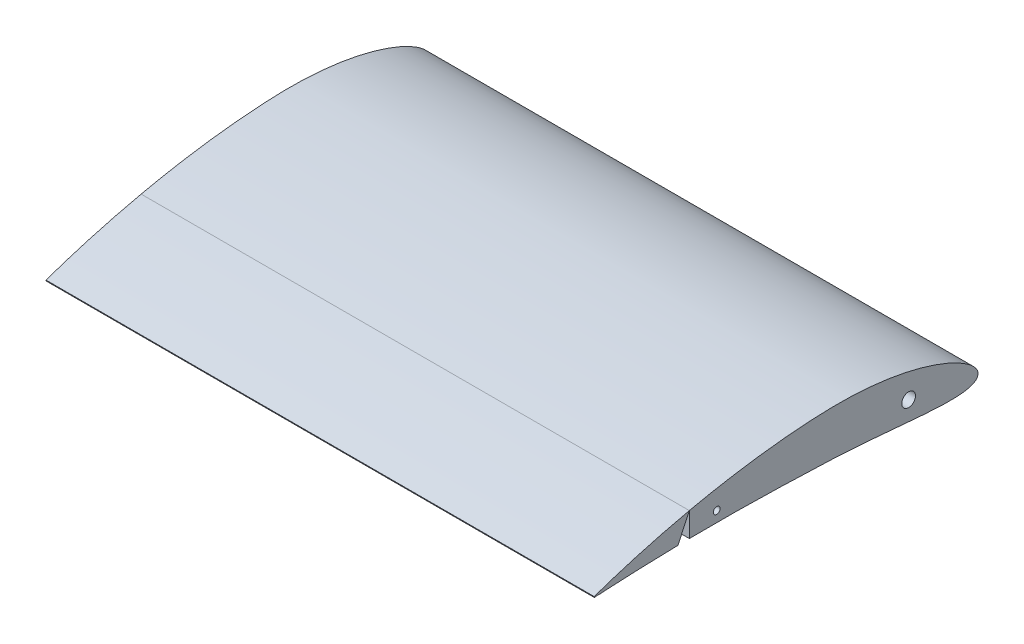
ISO-10303-21;
HEADER;
FILE_DESCRIPTION(('STEP AP214'),'2;1');
FILE_NAME('part.step','',(''),(''),'','','');
FILE_SCHEMA(('AUTOMOTIVE_DESIGN { 1 0 10303 214 1 1 1 1 }'));
ENDSEC;
DATA;
#1=APPLICATION_CONTEXT('core data for automotive mechanical design processes');
#2=APPLICATION_PROTOCOL_DEFINITION('international standard','automotive_design',2000,#1);
#3=PRODUCT_CONTEXT('',#1,'mechanical');
#4=PRODUCT('Part','Part','',(#3));
#5=PRODUCT_RELATED_PRODUCT_CATEGORY('part','',(#4));
#6=PRODUCT_DEFINITION_FORMATION('','',#4);
#7=PRODUCT_DEFINITION_CONTEXT('part definition',#1,'design');
#8=PRODUCT_DEFINITION('design','',#6,#7);
#9=PRODUCT_DEFINITION_SHAPE('','',#8);
#10=(LENGTH_UNIT() NAMED_UNIT(*) SI_UNIT(.MILLI.,.METRE.));
#11=(NAMED_UNIT(*) PLANE_ANGLE_UNIT() SI_UNIT($,.RADIAN.));
#12=(NAMED_UNIT(*) SI_UNIT($,.STERADIAN.) SOLID_ANGLE_UNIT());
#13=UNCERTAINTY_MEASURE_WITH_UNIT(LENGTH_MEASURE(1.E-05),#10,'distance_accuracy_value','');
#14=(GEOMETRIC_REPRESENTATION_CONTEXT(3) GLOBAL_UNCERTAINTY_ASSIGNED_CONTEXT((#13)) GLOBAL_UNIT_ASSIGNED_CONTEXT((#10,
#11,#12)) REPRESENTATION_CONTEXT('',''));
#15=CARTESIAN_POINT('',(0.,0.,0.));
#16=DIRECTION('',(0.,0.,1.));
#17=DIRECTION('',(1.,0.,0.));
#18=AXIS2_PLACEMENT_3D('',#15,#16,#17);
#19=CARTESIAN_POINT('',(-254.,-0.0302571964763549,354.787327227915));
#20=CARTESIAN_POINT('',(-254.,-0.202511549774369,354.777220058735));
#21=CARTESIAN_POINT('',(-254.,-0.758116619532224,354.744619463571));
#22=CARTESIAN_POINT('',(-254.,-0.0353878265544988,352.780150329408));
#23=CARTESIAN_POINT('',(-254.,-0.406394891328532,350.227621537646));
#24=CARTESIAN_POINT('',(-254.,0.191518705423128,345.076973542852));
#25=CARTESIAN_POINT('',(-254.,0.426846954997304,338.388880463138));
#26=CARTESIAN_POINT('',(-254.,0.912902226587254,329.767358245601));
#27=CARTESIAN_POINT('',(-254.,1.37107480853054,319.513378005819));
#28=CARTESIAN_POINT('',(-254.,1.85212662662604,307.681856469284));
#29=CARTESIAN_POINT('',(-254.,2.2828903737653,294.437996631764));
#30=CARTESIAN_POINT('',(-254.,2.65636592644588,279.933149694368));
#31=CARTESIAN_POINT('',(-254.,2.90744759821903,264.337268620967));
#32=CARTESIAN_POINT('',(-254.,3.02848065946825,247.830237404837));
#33=CARTESIAN_POINT('',(-254.,2.97910623211237,224.541124113717));
#34=CARTESIAN_POINT('',(-254.,2.58624656268472,200.671973719441));
#35=CARTESIAN_POINT('',(-254.,1.91789319340299,176.483884619505));
#36=CARTESIAN_POINT('',(-254.,1.28674404323604,158.296467958687));
#37=CARTESIAN_POINT('',(-254.,0.674535202653767,140.48477689744));
#38=CARTESIAN_POINT('',(-254.,-0.458414507964394,117.937239158073));
#39=CARTESIAN_POINT('',(-254.,-2.15355585803942,96.4067365521407));
#40=CARTESIAN_POINT('',(-254.,-3.98391169785236,75.9298626432168));
#41=CARTESIAN_POINT('',(-254.,-5.23803481691952,61.9523939500743));
#42=CARTESIAN_POINT('',(-254.,-6.3018667845873,49.0830780174977));
#43=CARTESIAN_POINT('',(-254.,-7.05379709208437,37.4470572233417));
#44=CARTESIAN_POINT('',(-254.,-7.40487495085787,27.1638266260831));
#45=CARTESIAN_POINT('',(-254.,-7.26852765592077,18.3491197902741));
#46=CARTESIAN_POINT('',(-254.,-6.58746462442697,11.0873159681167));
#47=CARTESIAN_POINT('',(-254.,-5.28808573883758,5.4507808849597));
#48=CARTESIAN_POINT('',(-254.,-3.30894318563573,1.35108725963543));
#49=CARTESIAN_POINT('',(-254.,-0.148325215865237,-0.987487677240321));
#50=CARTESIAN_POINT('',(-254.,3.7967578133831,-0.765838064798878));
#51=CARTESIAN_POINT('',(-254.,7.71649979382027,1.67922407257184));
#52=CARTESIAN_POINT('',(-254.,11.8553419578337,5.92689766090299));
#53=CARTESIAN_POINT('',(-254.,16.2262899348965,12.1072031542234));
#54=CARTESIAN_POINT('',(-254.,20.7343193498453,20.187014187513));
#55=CARTESIAN_POINT('',(-254.,25.2201252971746,30.130463623116));
#56=CARTESIAN_POINT('',(-254.,29.5108543834638,41.8433907768923));
#57=CARTESIAN_POINT('',(-254.,33.4329059974258,55.1997604360673));
#58=CARTESIAN_POINT('',(-254.,36.8104805743368,70.0434509571498));
#59=CARTESIAN_POINT('',(-254.,39.4786761807971,86.1884085277303));
#60=CARTESIAN_POINT('',(-254.,41.32105063238,103.42216726238));
#61=CARTESIAN_POINT('',(-254.,42.2288581946823,121.516747473044));
#62=CARTESIAN_POINT('',(-254.,42.1113766684293,140.09669102153));
#63=CARTESIAN_POINT('',(-254.,41.1132128906756,158.902335219002));
#64=CARTESIAN_POINT('',(-254.,39.0904540579609,183.961657870227));
#65=CARTESIAN_POINT('',(-254.,36.0047557168601,208.774809212926));
#66=CARTESIAN_POINT('',(-254.,31.1455287976255,238.622276389231));
#67=CARTESIAN_POINT('',(-254.,26.6515697314507,261.175777938493));
#68=CARTESIAN_POINT('',(-254.,21.7242725259394,282.422876263721));
#69=CARTESIAN_POINT('',(-254.,17.1306006385399,300.598349456261));
#70=CARTESIAN_POINT('',(-254.,11.7988919274353,319.654473711953));
#71=CARTESIAN_POINT('',(-254.,6.72155114802005,336.024074691811));
#72=CARTESIAN_POINT('',(-254.,3.49779827393597,345.800950265157));
#73=CARTESIAN_POINT('',(-254.,1.92709586834348,350.478726649503));
#74=CARTESIAN_POINT('',(-254.,0.953557869568799,353.29965963041));
#75=CARTESIAN_POINT('',(-254.,0.519388000117919,354.559877308969));
#76=CARTESIAN_POINT('',(-254.,0.410417886541196,354.876173010782));
#77=B_SPLINE_CURVE_WITH_KNOTS('',3,(#19,#20,#21,#22,#23,#24,#25,#26,#27,#28,#29,#30,#31,#32,#33,
#34,#35,#36,#37,#38,#39,#40,#41,#42,#43,#44,#45,#46,#47,#48,#49,#50,#51,#52,#53,#54,#55,#56,#57,
#58,#59,#60,#61,#62,#63,#64,#65,#66,#67,#68,#69,#70,#71,#72,#73,#74,#75,#76),.UNSPECIFIED.,.F.,
.F.,(4,1,1,1,1,1,1,1,1,1,1,1,1,1,1,1,1,1,1,1,1,1,1,1,1,1,1,1,1,1,1,1,1,1,1,1,1,1,1,1,1,1,1,1,1,
1,1,1,1,1,1,1,1,1,1,4),(0.,0.00061435602735338,0.00198160056276364,0.00606849911990259,
0.0128259983002053,0.0221600600259541,0.0339528411484215,0.0480573219049674,0.0643016527838605,
0.0824806064748046,0.102390013464696,0.123786894847983,0.146429707819126,0.170067604158041,
0.219268231220122,0.244299756437978,0.269272617042279,0.293879334559277,0.317367886846568,
0.361825599196296,0.382415541627446,0.401655123624231,0.419361860817184,0.435356743556399,
0.44945739068769,0.461534248286615,0.471483960270294,0.479298491667603,0.485175806315722,
0.489815015537041,0.49445371882196,0.500384211459872,0.508369297965653,0.518670584727767,
0.531320006060474,0.54625561026072,0.563345994084458,0.58242326585592,0.60328874622392,
0.625720296766354,0.649474912467889,0.674310012117921,0.699958821683972,0.725614899189679,
0.751503233324799,0.803021620411888,0.828087427427487,0.875472920842336,0.897280851310736,
0.917503738861992,0.952328750245583,0.978398030734231,0.987765198149775,0.994535224157492,
0.998628423374974,1.),.UNSPECIFIED.);
#78=DIRECTION('',(1.,0.,0.));
#79=VECTOR('',#78,1.);
#80=SURFACE_OF_LINEAR_EXTRUSION('',#77,#79);
#81=DIRECTION('',(1.,0.,0.));
#82=VECTOR('',#81,1.);
#83=CARTESIAN_POINT('',(-254.,2.68576626150921,277.250314183645));
#84=LINE('',#83,#82);
#85=CARTESIAN_POINT('',(-254.,2.6857662610756,277.250314183847));
#86=VERTEX_POINT('',#85);
#87=CARTESIAN_POINT('',(254.,2.68576626107558,277.250314183847));
#88=VERTEX_POINT('',#87);
#89=EDGE_CURVE('E68',#86,#88,#84,.T.);
#90=ORIENTED_EDGE('',*,*,#89,.T.);
#91=CARTESIAN_POINT('',(254.,-0.0302571964763549,354.787327227915));
#92=CARTESIAN_POINT('',(254.,-0.202511549774369,354.777220058735));
#93=CARTESIAN_POINT('',(254.,-0.758116619532224,354.744619463571));
#94=CARTESIAN_POINT('',(254.,-0.0353878265544988,352.780150329408));
#95=CARTESIAN_POINT('',(254.,-0.406394891328532,350.227621537646));
#96=CARTESIAN_POINT('',(254.,0.191518705423128,345.076973542852));
#97=CARTESIAN_POINT('',(254.,0.426846954997304,338.388880463138));
#98=CARTESIAN_POINT('',(254.,0.912902226587254,329.767358245601));
#99=CARTESIAN_POINT('',(254.,1.37107480853054,319.513378005819));
#100=CARTESIAN_POINT('',(254.,1.85212662662604,307.681856469284));
#101=CARTESIAN_POINT('',(254.,2.2828903737653,294.437996631764));
#102=CARTESIAN_POINT('',(254.,2.65636592644588,279.933149694368));
#103=CARTESIAN_POINT('',(254.,2.90744759821903,264.337268620967));
#104=CARTESIAN_POINT('',(254.,3.02848065946825,247.830237404837));
#105=CARTESIAN_POINT('',(254.,2.97910623211237,224.541124113717));
#106=CARTESIAN_POINT('',(254.,2.58624656268472,200.671973719441));
#107=CARTESIAN_POINT('',(254.,1.91789319340299,176.483884619505));
#108=CARTESIAN_POINT('',(254.,1.28674404323604,158.296467958687));
#109=CARTESIAN_POINT('',(254.,0.674535202653767,140.48477689744));
#110=CARTESIAN_POINT('',(254.,-0.458414507964394,117.937239158073));
#111=CARTESIAN_POINT('',(254.,-2.15355585803942,96.4067365521407));
#112=CARTESIAN_POINT('',(254.,-3.98391169785236,75.9298626432168));
#113=CARTESIAN_POINT('',(254.,-5.23803481691952,61.9523939500743));
#114=CARTESIAN_POINT('',(254.,-6.3018667845873,49.0830780174977));
#115=CARTESIAN_POINT('',(254.,-7.05379709208437,37.4470572233417));
#116=CARTESIAN_POINT('',(254.,-7.40487495085787,27.1638266260831));
#117=CARTESIAN_POINT('',(254.,-7.26852765592077,18.3491197902741));
#118=CARTESIAN_POINT('',(254.,-6.58746462442697,11.0873159681167));
#119=CARTESIAN_POINT('',(254.,-5.28808573883758,5.4507808849597));
#120=CARTESIAN_POINT('',(254.,-3.30894318563573,1.35108725963543));
#121=CARTESIAN_POINT('',(254.,-0.148325215865237,-0.987487677240321));
#122=CARTESIAN_POINT('',(254.,3.7967578133831,-0.765838064798878));
#123=CARTESIAN_POINT('',(254.,7.71649979382027,1.67922407257184));
#124=CARTESIAN_POINT('',(254.,11.8553419578337,5.92689766090299));
#125=CARTESIAN_POINT('',(254.,16.2262899348965,12.1072031542234));
#126=CARTESIAN_POINT('',(254.,20.7343193498453,20.187014187513));
#127=CARTESIAN_POINT('',(254.,25.2201252971746,30.130463623116));
#128=CARTESIAN_POINT('',(254.,29.5108543834638,41.8433907768923));
#129=CARTESIAN_POINT('',(254.,33.4329059974258,55.1997604360673));
#130=CARTESIAN_POINT('',(254.,36.8104805743368,70.0434509571498));
#131=CARTESIAN_POINT('',(254.,39.4786761807971,86.1884085277303));
#132=CARTESIAN_POINT('',(254.,41.32105063238,103.42216726238));
#133=CARTESIAN_POINT('',(254.,42.2288581946823,121.516747473044));
#134=CARTESIAN_POINT('',(254.,42.1113766684293,140.09669102153));
#135=CARTESIAN_POINT('',(254.,41.1132128906756,158.902335219002));
#136=CARTESIAN_POINT('',(254.,39.0904540579609,183.961657870227));
#137=CARTESIAN_POINT('',(254.,36.0047557168601,208.774809212926));
#138=CARTESIAN_POINT('',(254.,31.1455287976255,238.622276389231));
#139=CARTESIAN_POINT('',(254.,26.6515697314507,261.175777938493));
#140=CARTESIAN_POINT('',(254.,21.7242725259394,282.422876263721));
#141=CARTESIAN_POINT('',(254.,17.1306006385399,300.598349456261));
#142=CARTESIAN_POINT('',(254.,11.7988919274353,319.654473711953));
#143=CARTESIAN_POINT('',(254.,6.72155114802005,336.024074691811));
#144=CARTESIAN_POINT('',(254.,3.49779827393597,345.800950265157));
#145=CARTESIAN_POINT('',(254.,1.92709586834348,350.478726649503));
#146=CARTESIAN_POINT('',(254.,0.953557869568799,353.29965963041));
#147=CARTESIAN_POINT('',(254.,0.519388000117919,354.559877308969));
#148=CARTESIAN_POINT('',(254.,0.410417886541196,354.876173010782));
#149=B_SPLINE_CURVE_WITH_KNOTS('',3,(#91,#92,#93,#94,#95,#96,#97,#98,#99,#100,#101,#102,#103,
#104,#105,#106,#107,#108,#109,#110,#111,#112,#113,#114,#115,#116,#117,#118,#119,#120,#121,#122,
#123,#124,#125,#126,#127,#128,#129,#130,#131,#132,#133,#134,#135,#136,#137,#138,#139,#140,#141,
#142,#143,#144,#145,#146,#147,#148),.UNSPECIFIED.,.F.,.F.,(4,1,1,1,1,1,1,1,1,1,1,1,1,1,1,1,1,1,
1,1,1,1,1,1,1,1,1,1,1,1,1,1,1,1,1,1,1,1,1,1,1,1,1,1,1,1,1,1,1,1,1,1,1,1,1,4),(0.,
0.00061435602735338,0.00198160056276364,0.00606849911990259,0.0128259983002053,
0.0221600600259541,0.0339528411484215,0.0480573219049674,0.0643016527838605,0.0824806064748046,
0.102390013464696,0.123786894847983,0.146429707819126,0.170067604158041,0.219268231220122,
0.244299756437978,0.269272617042279,0.293879334559277,0.317367886846568,0.361825599196296,
0.382415541627446,0.401655123624231,0.419361860817184,0.435356743556399,0.44945739068769,
0.461534248286615,0.471483960270294,0.479298491667603,0.485175806315722,0.489815015537041,
0.49445371882196,0.500384211459872,0.508369297965653,0.518670584727767,0.531320006060474,
0.54625561026072,0.563345994084458,0.58242326585592,0.60328874622392,0.625720296766354,
0.649474912467889,0.674310012117921,0.699958821683972,0.725614899189679,0.751503233324799,
0.803021620411888,0.828087427427487,0.875472920842336,0.897280851310736,0.917503738861992,
0.952328750245583,0.978398030734231,0.987765198149775,0.994535224157492,0.998628423374974,1.),.UNSPECIFIED.);
#150=CARTESIAN_POINT('',(254.,-0.030257196476355,354.787327227915));
#151=VERTEX_POINT('',#150);
#152=EDGE_CURVE('E54',#151,#88,#149,.T.);
#153=ORIENTED_EDGE('',*,*,#152,.F.);
#154=DIRECTION('',(1.,0.,0.));
#155=VECTOR('',#154,1.);
#156=CARTESIAN_POINT('',(-254.,-0.030257196476355,354.787327227915));
#157=LINE('',#156,#155);
#158=CARTESIAN_POINT('',(-254.,-0.030257196476355,354.787327227915));
#159=VERTEX_POINT('',#158);
#160=EDGE_CURVE('E121',#159,#151,#157,.T.);
#161=ORIENTED_EDGE('',*,*,#160,.F.);
#162=EDGE_CURVE('E103',#159,#86,#77,.T.);
#163=ORIENTED_EDGE('',*,*,#162,.T.);
#164=EDGE_LOOP('',(#90,#153,#161,#163));
#165=FACE_BOUND('',#164,.T.);
#166=ADVANCED_FACE('F50',(#165),#80,.T.);
#167=CARTESIAN_POINT('',(254.,25.3109880456868,266.699999982787));
#168=VERTEX_POINT('',#167);
#169=CARTESIAN_POINT('',(254.,0.410417886541196,354.876173010782));
#170=VERTEX_POINT('',#169);
#171=EDGE_CURVE('E101',#168,#170,#149,.T.);
#172=ORIENTED_EDGE('',*,*,#171,.F.);
#173=DIRECTION('',(-1.,0.,0.));
#174=VECTOR('',#173,1.);
#175=CARTESIAN_POINT('',(254.001,25.3109880418854,266.7));
#176=LINE('',#175,#174);
#177=CARTESIAN_POINT('',(-254.,25.3109880418854,266.7));
#178=VERTEX_POINT('',#177);
#179=EDGE_CURVE('E87',#168,#178,#176,.T.);
#180=ORIENTED_EDGE('',*,*,#179,.T.);
#181=CARTESIAN_POINT('',(-254.,0.410417886541196,354.876173010782));
#182=VERTEX_POINT('',#181);
#183=EDGE_CURVE('E99',#178,#182,#77,.T.);
#184=ORIENTED_EDGE('',*,*,#183,.T.);
#185=DIRECTION('',(1.,0.,0.));
#186=VECTOR('',#185,1.);
#187=CARTESIAN_POINT('',(-254.,0.410417886541196,354.876173010782));
#188=LINE('',#187,#186);
#189=EDGE_CURVE('E108',#182,#170,#188,.T.);
#190=ORIENTED_EDGE('',*,*,#189,.T.);
#191=EDGE_LOOP('',(#172,#180,#184,#190));
#192=FACE_BOUND('',#191,.T.);
#193=ADVANCED_FACE('F97',(#192),#80,.T.);
#194=CARTESIAN_POINT('',(-254.,6.95548452892668,1.34686834904547));
#195=DIRECTION('',(-1.,0.,0.));
#196=DIRECTION('',(0.,0.,1.));
#197=AXIS2_PLACEMENT_3D('',#194,#195,#196);
#198=PLANE('',#197);
#199=DIRECTION('',(0.,0.906307787036649,-0.422618261740701));
#200=VECTOR('',#199,1.);
#201=CARTESIAN_POINT('',(-254.,25.3109880418854,266.7));
#202=LINE('',#201,#200);
#203=EDGE_CURVE('E61',#86,#178,#202,.T.);
#204=ORIENTED_EDGE('',*,*,#203,.F.);
#205=ORIENTED_EDGE('',*,*,#162,.F.);
#206=DIRECTION('',(0.,-0.980275441523261,-0.197636177726589));
#207=VECTOR('',#206,1.);
#208=CARTESIAN_POINT('',(-254.,-0.030257196476355,354.787327227915));
#209=LINE('',#208,#207);
#210=EDGE_CURVE('E94',#182,#159,#209,.T.);
#211=ORIENTED_EDGE('',*,*,#210,.F.);
#212=ORIENTED_EDGE('',*,*,#183,.F.);
#213=EDGE_LOOP('',(#204,#205,#211,#212));
#214=FACE_BOUND('',#213,.T.);
#215=ADVANCED_FACE('F106',(#214),#198,.T.);
#216=CARTESIAN_POINT('',(254.,6.95548452892668,1.34686834904547));
#217=DIRECTION('',(-1.,0.,0.));
#218=DIRECTION('',(0.,0.,1.));
#219=AXIS2_PLACEMENT_3D('',#216,#217,#218);
#220=PLANE('',#219);
#221=ORIENTED_EDGE('',*,*,#152,.T.);
#222=DIRECTION('',(0.,-0.906307787036649,0.422618261740702));
#223=VECTOR('',#222,1.);
#224=CARTESIAN_POINT('',(254.,25.3109880418854,266.7));
#225=LINE('',#224,#223);
#226=EDGE_CURVE('E12',#168,#88,#225,.T.);
#227=ORIENTED_EDGE('',*,*,#226,.F.);
#228=ORIENTED_EDGE('',*,*,#171,.T.);
#229=DIRECTION('',(0.,-0.980275441523261,-0.197636177726589));
#230=VECTOR('',#229,1.);
#231=CARTESIAN_POINT('',(254.,-0.030257196476355,354.787327227915));
#232=LINE('',#231,#230);
#233=EDGE_CURVE('E118',#170,#151,#232,.T.);
#234=ORIENTED_EDGE('',*,*,#233,.T.);
#235=EDGE_LOOP('',(#221,#227,#228,#234));
#236=FACE_BOUND('',#235,.T.);
#237=ADVANCED_FACE('F127',(#236),#220,.F.);
#238=CARTESIAN_POINT('',(-254.,-0.030257196476355,354.787327227915));
#239=DIRECTION('',(0.,-0.197636177726589,0.980275441523261));
#240=DIRECTION('',(0.,-0.980275441523261,-0.197636177726589));
#241=AXIS2_PLACEMENT_3D('',#238,#239,#240);
#242=PLANE('',#241);
#243=ORIENTED_EDGE('',*,*,#160,.T.);
#244=ORIENTED_EDGE('',*,*,#233,.F.);
#245=ORIENTED_EDGE('',*,*,#189,.F.);
#246=ORIENTED_EDGE('',*,*,#210,.T.);
#247=EDGE_LOOP('',(#243,#244,#245,#246));
#248=FACE_BOUND('',#247,.T.);
#249=ADVANCED_FACE('F125',(#248),#242,.T.);
#250=CARTESIAN_POINT('',(254.001,25.3109880418854,266.7));
#251=DIRECTION('',(0.,0.422618261740701,0.906307787036649));
#252=DIRECTION('',(0.,-0.906307787036649,0.422618261740702));
#253=AXIS2_PLACEMENT_3D('',#250,#251,#252);
#254=PLANE('',#253);
#255=ORIENTED_EDGE('',*,*,#203,.T.);
#256=ORIENTED_EDGE('',*,*,#179,.F.);
#257=ORIENTED_EDGE('',*,*,#226,.T.);
#258=ORIENTED_EDGE('',*,*,#89,.F.);
#259=EDGE_LOOP('',(#255,#256,#257,#258));
#260=FACE_BOUND('',#259,.T.);
#261=ADVANCED_FACE('F89',(#260),#254,.F.);
#262=CLOSED_SHELL('',(#166,#193,#215,#237,#249,#261));
#263=MANIFOLD_SOLID_BREP('B2',#262);
#264=CARTESIAN_POINT('',(254.,6.95548452892668,1.34686834904547));
#265=DIRECTION('',(-1.,0.,0.));
#266=DIRECTION('',(0.,0.,1.));
#267=AXIS2_PLACEMENT_3D('',#264,#265,#266);
#268=PLANE('',#267);
#269=CARTESIAN_POINT('',(254.,12.7,241.3));
#270=DIRECTION('',(1.,0.,0.));
#271=DIRECTION('',(0.,0.,-1.));
#272=AXIS2_PLACEMENT_3D('',#269,#270,#271);
#273=CIRCLE('',#272,3.175);
#274=CARTESIAN_POINT('',(254.,12.7,238.125));
#275=VERTEX_POINT('',#274);
#276=EDGE_CURVE('E250',#275,#275,#273,.T.);
#277=ORIENTED_EDGE('',*,*,#276,.F.);
#278=EDGE_LOOP('',(#277));
#279=FACE_BOUND('',#278,.T.);
#280=CARTESIAN_POINT('',(254.,12.7,63.5));
#281=DIRECTION('',(1.,0.,0.));
#282=DIRECTION('',(0.,0.,-1.));
#283=AXIS2_PLACEMENT_3D('',#280,#281,#282);
#284=CIRCLE('',#283,6.35);
#285=CARTESIAN_POINT('',(254.,12.7,57.15));
#286=VERTEX_POINT('',#285);
#287=EDGE_CURVE('E242',#286,#286,#284,.T.);
#288=ORIENTED_EDGE('',*,*,#287,.F.);
#289=EDGE_LOOP('',(#288));
#290=FACE_BOUND('',#289,.T.);
#291=CARTESIAN_POINT('',(254.,-0.0302571964763549,354.787327227915));
#292=CARTESIAN_POINT('',(254.,-0.202511549774369,354.777220058735));
#293=CARTESIAN_POINT('',(254.,-0.758116619532224,354.744619463571));
#294=CARTESIAN_POINT('',(254.,-0.0353878265544988,352.780150329408));
#295=CARTESIAN_POINT('',(254.,-0.406394891328532,350.227621537646));
#296=CARTESIAN_POINT('',(254.,0.191518705423128,345.076973542852));
#297=CARTESIAN_POINT('',(254.,0.426846954997304,338.388880463138));
#298=CARTESIAN_POINT('',(254.,0.912902226587254,329.767358245601));
#299=CARTESIAN_POINT('',(254.,1.37107480853054,319.513378005819));
#300=CARTESIAN_POINT('',(254.,1.85212662662604,307.681856469284));
#301=CARTESIAN_POINT('',(254.,2.2828903737653,294.437996631764));
#302=CARTESIAN_POINT('',(254.,2.65636592644588,279.933149694368));
#303=CARTESIAN_POINT('',(254.,2.90744759821903,264.337268620967));
#304=CARTESIAN_POINT('',(254.,3.02848065946825,247.830237404837));
#305=CARTESIAN_POINT('',(254.,2.97910623211237,224.541124113717));
#306=CARTESIAN_POINT('',(254.,2.58624656268472,200.671973719441));
#307=CARTESIAN_POINT('',(254.,1.91789319340299,176.483884619505));
#308=CARTESIAN_POINT('',(254.,1.28674404323604,158.296467958687));
#309=CARTESIAN_POINT('',(254.,0.674535202653767,140.48477689744));
#310=CARTESIAN_POINT('',(254.,-0.458414507964394,117.937239158073));
#311=CARTESIAN_POINT('',(254.,-2.15355585803942,96.4067365521407));
#312=CARTESIAN_POINT('',(254.,-3.98391169785236,75.9298626432168));
#313=CARTESIAN_POINT('',(254.,-5.23803481691952,61.9523939500743));
#314=CARTESIAN_POINT('',(254.,-6.3018667845873,49.0830780174977));
#315=CARTESIAN_POINT('',(254.,-7.05379709208437,37.4470572233417));
#316=CARTESIAN_POINT('',(254.,-7.40487495085787,27.1638266260831));
#317=CARTESIAN_POINT('',(254.,-7.26852765592077,18.3491197902741));
#318=CARTESIAN_POINT('',(254.,-6.58746462442697,11.0873159681167));
#319=CARTESIAN_POINT('',(254.,-5.28808573883758,5.4507808849597));
#320=CARTESIAN_POINT('',(254.,-3.30894318563573,1.35108725963543));
#321=CARTESIAN_POINT('',(254.,-0.148325215865237,-0.987487677240321));
#322=CARTESIAN_POINT('',(254.,3.7967578133831,-0.765838064798878));
#323=CARTESIAN_POINT('',(254.,7.71649979382027,1.67922407257184));
#324=CARTESIAN_POINT('',(254.,11.8553419578337,5.92689766090299));
#325=CARTESIAN_POINT('',(254.,16.2262899348965,12.1072031542234));
#326=CARTESIAN_POINT('',(254.,20.7343193498453,20.187014187513));
#327=CARTESIAN_POINT('',(254.,25.2201252971746,30.130463623116));
#328=CARTESIAN_POINT('',(254.,29.5108543834638,41.8433907768923));
#329=CARTESIAN_POINT('',(254.,33.4329059974258,55.1997604360673));
#330=CARTESIAN_POINT('',(254.,36.8104805743368,70.0434509571498));
#331=CARTESIAN_POINT('',(254.,39.4786761807971,86.1884085277303));
#332=CARTESIAN_POINT('',(254.,41.32105063238,103.42216726238));
#333=CARTESIAN_POINT('',(254.,42.2288581946823,121.516747473044));
#334=CARTESIAN_POINT('',(254.,42.1113766684293,140.09669102153));
#335=CARTESIAN_POINT('',(254.,41.1132128906756,158.902335219002));
#336=CARTESIAN_POINT('',(254.,39.0904540579609,183.961657870227));
#337=CARTESIAN_POINT('',(254.,36.0047557168601,208.774809212926));
#338=CARTESIAN_POINT('',(254.,31.1455287976255,238.622276389231));
#339=CARTESIAN_POINT('',(254.,26.6515697314507,261.175777938493));
#340=CARTESIAN_POINT('',(254.,21.7242725259394,282.422876263721));
#341=CARTESIAN_POINT('',(254.,17.1306006385399,300.598349456261));
#342=CARTESIAN_POINT('',(254.,11.7988919274353,319.654473711953));
#343=CARTESIAN_POINT('',(254.,6.72155114802005,336.024074691811));
#344=CARTESIAN_POINT('',(254.,3.49779827393597,345.800950265157));
#345=CARTESIAN_POINT('',(254.,1.92709586834348,350.478726649503));
#346=CARTESIAN_POINT('',(254.,0.953557869568799,353.29965963041));
#347=CARTESIAN_POINT('',(254.,0.519388000117919,354.559877308969));
#348=CARTESIAN_POINT('',(254.,0.410417886541196,354.876173010782));
#349=B_SPLINE_CURVE_WITH_KNOTS('',3,(#291,#292,#293,#294,#295,#296,#297,#298,#299,#300,#301,
#302,#303,#304,#305,#306,#307,#308,#309,#310,#311,#312,#313,#314,#315,#316,#317,#318,#319,#320,
#321,#322,#323,#324,#325,#326,#327,#328,#329,#330,#331,#332,#333,#334,#335,#336,#337,#338,#339,
#340,#341,#342,#343,#344,#345,#346,#347,#348),.UNSPECIFIED.,.F.,.F.,(4,1,1,1,1,1,1,1,1,1,1,1,1,
1,1,1,1,1,1,1,1,1,1,1,1,1,1,1,1,1,1,1,1,1,1,1,1,1,1,1,1,1,1,1,1,1,1,1,1,1,1,1,1,1,1,4),(0.,
0.00061435602735338,0.00198160056276364,0.00606849911990259,0.0128259983002053,
0.0221600600259541,0.0339528411484215,0.0480573219049674,0.0643016527838605,0.0824806064748046,
0.102390013464696,0.123786894847983,0.146429707819126,0.170067604158041,0.219268231220122,
0.244299756437978,0.269272617042279,0.293879334559277,0.317367886846568,0.361825599196296,
0.382415541627446,0.401655123624231,0.419361860817184,0.435356743556399,0.44945739068769,
0.461534248286615,0.471483960270294,0.479298491667603,0.485175806315722,0.489815015537041,
0.49445371882196,0.500384211459872,0.508369297965653,0.518670584727767,0.531320006060474,
0.54625561026072,0.563345994084458,0.58242326585592,0.60328874622392,0.625720296766354,
0.649474912467889,0.674310012117921,0.699958821683972,0.725614899189679,0.751503233324799,
0.803021620411888,0.828087427427487,0.875472920842336,0.897280851310736,0.917503738861992,
0.952328750245583,0.978398030734231,0.987765198149775,0.994535224157492,0.998628423374974,1.),.UNSPECIFIED.);
#350=CARTESIAN_POINT('',(254.,2.85478886450617,266.699999999999));
#351=VERTEX_POINT('',#350);
#352=CARTESIAN_POINT('',(254.,25.3109880418854,266.7));
#353=VERTEX_POINT('',#352);
#354=EDGE_CURVE('E220',#351,#353,#349,.T.);
#355=ORIENTED_EDGE('',*,*,#354,.T.);
#356=DIRECTION('',(0.,1.,0.));
#357=VECTOR('',#356,1.);
#358=CARTESIAN_POINT('',(254.,25.3109880418854,266.7));
#359=LINE('',#358,#357);
#360=EDGE_CURVE('E215',#351,#353,#359,.T.);
#361=ORIENTED_EDGE('',*,*,#360,.F.);
#362=EDGE_LOOP('',(#355,#361));
#363=FACE_BOUND('',#362,.T.);
#364=ADVANCED_FACE('F185',(#279,#290,#363),#268,.F.);
#365=CARTESIAN_POINT('',(-254.,6.95548452892668,1.34686834904547));
#366=DIRECTION('',(-1.,0.,0.));
#367=DIRECTION('',(0.,0.,1.));
#368=AXIS2_PLACEMENT_3D('',#365,#366,#367);
#369=PLANE('',#368);
#370=DIRECTION('',(0.,-1.,0.));
#371=VECTOR('',#370,1.);
#372=CARTESIAN_POINT('',(-254.,25.3109880418854,266.7));
#373=LINE('',#372,#371);
#374=CARTESIAN_POINT('',(-254.,25.3109880418854,266.7));
#375=VERTEX_POINT('',#374);
#376=CARTESIAN_POINT('',(-254.,2.85478886450617,266.699999999999));
#377=VERTEX_POINT('',#376);
#378=EDGE_CURVE('E210',#375,#377,#373,.T.);
#379=ORIENTED_EDGE('',*,*,#378,.F.);
#380=CARTESIAN_POINT('',(-254.,-0.0302571964763549,354.787327227915));
#381=CARTESIAN_POINT('',(-254.,-0.202511549774369,354.777220058735));
#382=CARTESIAN_POINT('',(-254.,-0.758116619532224,354.744619463571));
#383=CARTESIAN_POINT('',(-254.,-0.0353878265544988,352.780150329408));
#384=CARTESIAN_POINT('',(-254.,-0.406394891328532,350.227621537646));
#385=CARTESIAN_POINT('',(-254.,0.191518705423128,345.076973542852));
#386=CARTESIAN_POINT('',(-254.,0.426846954997304,338.388880463138));
#387=CARTESIAN_POINT('',(-254.,0.912902226587254,329.767358245601));
#388=CARTESIAN_POINT('',(-254.,1.37107480853054,319.513378005819));
#389=CARTESIAN_POINT('',(-254.,1.85212662662604,307.681856469284));
#390=CARTESIAN_POINT('',(-254.,2.2828903737653,294.437996631764));
#391=CARTESIAN_POINT('',(-254.,2.65636592644588,279.933149694368));
#392=CARTESIAN_POINT('',(-254.,2.90744759821903,264.337268620967));
#393=CARTESIAN_POINT('',(-254.,3.02848065946825,247.830237404837));
#394=CARTESIAN_POINT('',(-254.,2.97910623211237,224.541124113717));
#395=CARTESIAN_POINT('',(-254.,2.58624656268472,200.671973719441));
#396=CARTESIAN_POINT('',(-254.,1.91789319340299,176.483884619505));
#397=CARTESIAN_POINT('',(-254.,1.28674404323604,158.296467958687));
#398=CARTESIAN_POINT('',(-254.,0.674535202653767,140.48477689744));
#399=CARTESIAN_POINT('',(-254.,-0.458414507964394,117.937239158073));
#400=CARTESIAN_POINT('',(-254.,-2.15355585803942,96.4067365521407));
#401=CARTESIAN_POINT('',(-254.,-3.98391169785236,75.9298626432168));
#402=CARTESIAN_POINT('',(-254.,-5.23803481691952,61.9523939500743));
#403=CARTESIAN_POINT('',(-254.,-6.3018667845873,49.0830780174977));
#404=CARTESIAN_POINT('',(-254.,-7.05379709208437,37.4470572233417));
#405=CARTESIAN_POINT('',(-254.,-7.40487495085787,27.1638266260831));
#406=CARTESIAN_POINT('',(-254.,-7.26852765592077,18.3491197902741));
#407=CARTESIAN_POINT('',(-254.,-6.58746462442697,11.0873159681167));
#408=CARTESIAN_POINT('',(-254.,-5.28808573883758,5.4507808849597));
#409=CARTESIAN_POINT('',(-254.,-3.30894318563573,1.35108725963543));
#410=CARTESIAN_POINT('',(-254.,-0.148325215865237,-0.987487677240321));
#411=CARTESIAN_POINT('',(-254.,3.7967578133831,-0.765838064798878));
#412=CARTESIAN_POINT('',(-254.,7.71649979382027,1.67922407257184));
#413=CARTESIAN_POINT('',(-254.,11.8553419578337,5.92689766090299));
#414=CARTESIAN_POINT('',(-254.,16.2262899348965,12.1072031542234));
#415=CARTESIAN_POINT('',(-254.,20.7343193498453,20.187014187513));
#416=CARTESIAN_POINT('',(-254.,25.2201252971746,30.130463623116));
#417=CARTESIAN_POINT('',(-254.,29.5108543834638,41.8433907768923));
#418=CARTESIAN_POINT('',(-254.,33.4329059974258,55.1997604360673));
#419=CARTESIAN_POINT('',(-254.,36.8104805743368,70.0434509571498));
#420=CARTESIAN_POINT('',(-254.,39.4786761807971,86.1884085277303));
#421=CARTESIAN_POINT('',(-254.,41.32105063238,103.42216726238));
#422=CARTESIAN_POINT('',(-254.,42.2288581946823,121.516747473044));
#423=CARTESIAN_POINT('',(-254.,42.1113766684293,140.09669102153));
#424=CARTESIAN_POINT('',(-254.,41.1132128906756,158.902335219002));
#425=CARTESIAN_POINT('',(-254.,39.0904540579609,183.961657870227));
#426=CARTESIAN_POINT('',(-254.,36.0047557168601,208.774809212926));
#427=CARTESIAN_POINT('',(-254.,31.1455287976255,238.622276389231));
#428=CARTESIAN_POINT('',(-254.,26.6515697314507,261.175777938493));
#429=CARTESIAN_POINT('',(-254.,21.7242725259394,282.422876263721));
#430=CARTESIAN_POINT('',(-254.,17.1306006385399,300.598349456261));
#431=CARTESIAN_POINT('',(-254.,11.7988919274353,319.654473711953));
#432=CARTESIAN_POINT('',(-254.,6.72155114802005,336.024074691811));
#433=CARTESIAN_POINT('',(-254.,3.49779827393597,345.800950265157));
#434=CARTESIAN_POINT('',(-254.,1.92709586834348,350.478726649503));
#435=CARTESIAN_POINT('',(-254.,0.953557869568799,353.29965963041));
#436=CARTESIAN_POINT('',(-254.,0.519388000117919,354.559877308969));
#437=CARTESIAN_POINT('',(-254.,0.410417886541196,354.876173010782));
#438=B_SPLINE_CURVE_WITH_KNOTS('',3,(#380,#381,#382,#383,#384,#385,#386,#387,#388,#389,#390,
#391,#392,#393,#394,#395,#396,#397,#398,#399,#400,#401,#402,#403,#404,#405,#406,#407,#408,#409,
#410,#411,#412,#413,#414,#415,#416,#417,#418,#419,#420,#421,#422,#423,#424,#425,#426,#427,#428,
#429,#430,#431,#432,#433,#434,#435,#436,#437),.UNSPECIFIED.,.F.,.F.,(4,1,1,1,1,1,1,1,1,1,1,1,1,
1,1,1,1,1,1,1,1,1,1,1,1,1,1,1,1,1,1,1,1,1,1,1,1,1,1,1,1,1,1,1,1,1,1,1,1,1,1,1,1,1,1,4),(0.,
0.00061435602735338,0.00198160056276364,0.00606849911990259,0.0128259983002053,
0.0221600600259541,0.0339528411484215,0.0480573219049674,0.0643016527838605,0.0824806064748046,
0.102390013464696,0.123786894847983,0.146429707819126,0.170067604158041,0.219268231220122,
0.244299756437978,0.269272617042279,0.293879334559277,0.317367886846568,0.361825599196296,
0.382415541627446,0.401655123624231,0.419361860817184,0.435356743556399,0.44945739068769,
0.461534248286615,0.471483960270294,0.479298491667603,0.485175806315722,0.489815015537041,
0.49445371882196,0.500384211459872,0.508369297965653,0.518670584727767,0.531320006060474,
0.54625561026072,0.563345994084458,0.58242326585592,0.60328874622392,0.625720296766354,
0.649474912467889,0.674310012117921,0.699958821683972,0.725614899189679,0.751503233324799,
0.803021620411888,0.828087427427487,0.875472920842336,0.897280851310736,0.917503738861992,
0.952328750245583,0.978398030734231,0.987765198149775,0.994535224157492,0.998628423374974,1.),.UNSPECIFIED.);
#439=EDGE_CURVE('E194',#377,#375,#438,.T.);
#440=ORIENTED_EDGE('',*,*,#439,.F.);
#441=EDGE_LOOP('',(#379,#440));
#442=FACE_BOUND('',#441,.T.);
#443=ADVANCED_FACE('F224',(#442),#369,.T.);
#444=DIRECTION('',(1.,0.,0.));
#445=VECTOR('',#444,1.);
#446=SURFACE_OF_LINEAR_EXTRUSION('',#438,#445);
#447=DIRECTION('',(1.,0.,0.));
#448=VECTOR('',#447,1.);
#449=CARTESIAN_POINT('',(-254.,2.85478886450615,266.7));
#450=LINE('',#449,#448);
#451=EDGE_CURVE('E204',#351,#377,#450,.F.);
#452=ORIENTED_EDGE('',*,*,#451,.T.);
#453=ORIENTED_EDGE('',*,*,#439,.T.);
#454=DIRECTION('',(1.,0.,0.));
#455=VECTOR('',#454,1.);
#456=CARTESIAN_POINT('',(-254.,25.3109880418854,266.7));
#457=LINE('',#456,#455);
#458=EDGE_CURVE('E48',#353,#375,#457,.F.);
#459=ORIENTED_EDGE('',*,*,#458,.F.);
#460=ORIENTED_EDGE('',*,*,#354,.F.);
#461=EDGE_LOOP('',(#452,#453,#459,#460));
#462=FACE_BOUND('',#461,.T.);
#463=ADVANCED_FACE('F187',(#462),#446,.T.);
#464=CARTESIAN_POINT('',(254.001,25.3109880418854,266.7));
#465=DIRECTION('',(0.,0.,-1.));
#466=DIRECTION('',(0.,1.,0.));
#467=AXIS2_PLACEMENT_3D('',#464,#465,#466);
#468=PLANE('',#467);
#469=ORIENTED_EDGE('',*,*,#360,.T.);
#470=ORIENTED_EDGE('',*,*,#458,.T.);
#471=ORIENTED_EDGE('',*,*,#378,.T.);
#472=ORIENTED_EDGE('',*,*,#451,.F.);
#473=EDGE_LOOP('',(#469,#470,#471,#472));
#474=FACE_BOUND('',#473,.T.);
#475=ADVANCED_FACE('F211',(#474),#468,.F.);
#476=CARTESIAN_POINT('',(152.4,12.7,63.5));
#477=DIRECTION('',(1.,0.,0.));
#478=DIRECTION('',(0.,0.,-1.));
#479=AXIS2_PLACEMENT_3D('',#476,#477,#478);
#480=CYLINDRICAL_SURFACE('',#479,6.35);
#481=CARTESIAN_POINT('',(152.4,12.7,63.5));
#482=DIRECTION('',(1.,0.,0.));
#483=DIRECTION('',(0.,0.,-1.));
#484=AXIS2_PLACEMENT_3D('',#481,#482,#483);
#485=CIRCLE('',#484,6.35);
#486=CARTESIAN_POINT('',(152.4,12.7,57.15));
#487=VERTEX_POINT('',#486);
#488=EDGE_CURVE('E222',#487,#487,#485,.T.);
#489=ORIENTED_EDGE('',*,*,#488,.F.);
#490=EDGE_LOOP('',(#489));
#491=FACE_BOUND('',#490,.T.);
#492=ORIENTED_EDGE('',*,*,#287,.T.);
#493=EDGE_LOOP('',(#492));
#494=FACE_BOUND('',#493,.T.);
#495=ADVANCED_FACE('F273',(#491,#494),#480,.F.);
#496=CARTESIAN_POINT('',(152.4,12.7,63.5));
#497=DIRECTION('',(1.,0.,0.));
#498=DIRECTION('',(0.,0.,-1.));
#499=AXIS2_PLACEMENT_3D('',#496,#497,#498);
#500=PLANE('',#499);
#501=ORIENTED_EDGE('',*,*,#488,.T.);
#502=EDGE_LOOP('',(#501));
#503=FACE_BOUND('',#502,.T.);
#504=ADVANCED_FACE('F263',(#503),#500,.T.);
#505=CARTESIAN_POINT('',(127.,12.7,241.3));
#506=DIRECTION('',(1.,0.,0.));
#507=DIRECTION('',(0.,0.,-1.));
#508=AXIS2_PLACEMENT_3D('',#505,#506,#507);
#509=CYLINDRICAL_SURFACE('',#508,3.175);
#510=CARTESIAN_POINT('',(127.,12.7,241.3));
#511=DIRECTION('',(1.,0.,0.));
#512=DIRECTION('',(0.,0.,-1.));
#513=AXIS2_PLACEMENT_3D('',#510,#511,#512);
#514=CIRCLE('',#513,3.175);
#515=CARTESIAN_POINT('',(127.,12.7,238.125));
#516=VERTEX_POINT('',#515);
#517=EDGE_CURVE('E246',#516,#516,#514,.T.);
#518=ORIENTED_EDGE('',*,*,#517,.F.);
#519=EDGE_LOOP('',(#518));
#520=FACE_BOUND('',#519,.T.);
#521=ORIENTED_EDGE('',*,*,#276,.T.);
#522=EDGE_LOOP('',(#521));
#523=FACE_BOUND('',#522,.T.);
#524=ADVANCED_FACE('F260',(#520,#523),#509,.F.);
#525=CARTESIAN_POINT('',(127.,12.7,241.3));
#526=DIRECTION('',(1.,0.,0.));
#527=DIRECTION('',(0.,0.,-1.));
#528=AXIS2_PLACEMENT_3D('',#525,#526,#527);
#529=PLANE('',#528);
#530=ORIENTED_EDGE('',*,*,#517,.T.);
#531=EDGE_LOOP('',(#530));
#532=FACE_BOUND('',#531,.T.);
#533=ADVANCED_FACE('F258',(#532),#529,.T.);
#534=CLOSED_SHELL('',(#364,#443,#463,#475,#495,#504,#524,#533));
#535=MANIFOLD_SOLID_BREP('B6',#534);
#536=ADVANCED_BREP_SHAPE_REPRESENTATION('',(#18,#263,#535),#14);
#537=SHAPE_DEFINITION_REPRESENTATION(#9,#536);
ENDSEC;
END-ISO-10303-21;
